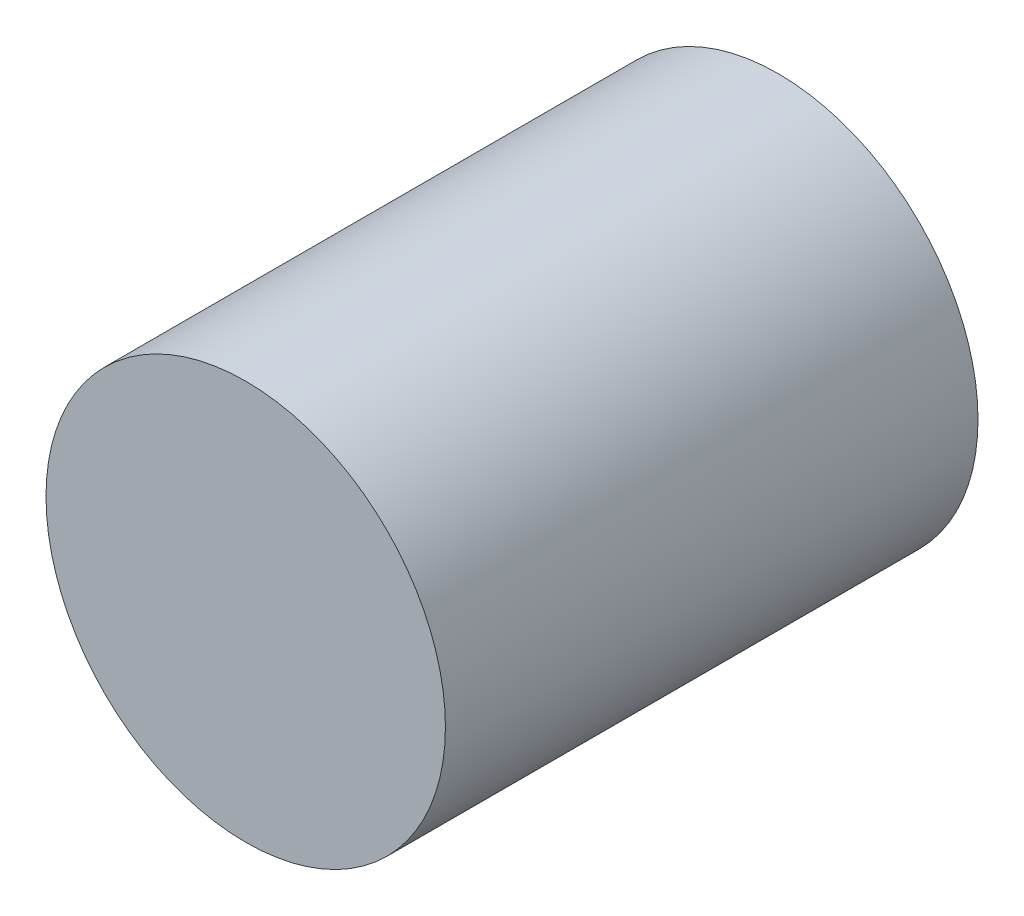
ISO-10303-21;
HEADER;
FILE_DESCRIPTION(('STEP AP214'),'2;1');
FILE_NAME('part.step','',(''),(''),'','','');
FILE_SCHEMA(('AUTOMOTIVE_DESIGN { 1 0 10303 214 1 1 1 1 }'));
ENDSEC;
DATA;
#1=APPLICATION_CONTEXT('core data for automotive mechanical design processes');
#2=APPLICATION_PROTOCOL_DEFINITION('international standard','automotive_design',2000,#1);
#3=PRODUCT_CONTEXT('',#1,'mechanical');
#4=PRODUCT('Part','Part','',(#3));
#5=PRODUCT_RELATED_PRODUCT_CATEGORY('part','',(#4));
#6=PRODUCT_DEFINITION_FORMATION('','',#4);
#7=PRODUCT_DEFINITION_CONTEXT('part definition',#1,'design');
#8=PRODUCT_DEFINITION('design','',#6,#7);
#9=PRODUCT_DEFINITION_SHAPE('','',#8);
#10=(LENGTH_UNIT() NAMED_UNIT(*) SI_UNIT(.MILLI.,.METRE.));
#11=(NAMED_UNIT(*) PLANE_ANGLE_UNIT() SI_UNIT($,.RADIAN.));
#12=(NAMED_UNIT(*) SI_UNIT($,.STERADIAN.) SOLID_ANGLE_UNIT());
#13=UNCERTAINTY_MEASURE_WITH_UNIT(LENGTH_MEASURE(1.E-05),#10,'distance_accuracy_value','');
#14=(GEOMETRIC_REPRESENTATION_CONTEXT(3) GLOBAL_UNCERTAINTY_ASSIGNED_CONTEXT((#13)) GLOBAL_UNIT_ASSIGNED_CONTEXT((#10,
#11,#12)) REPRESENTATION_CONTEXT('',''));
#15=CARTESIAN_POINT('',(0.,0.,0.));
#16=DIRECTION('',(0.,0.,1.));
#17=DIRECTION('',(1.,0.,0.));
#18=AXIS2_PLACEMENT_3D('',#15,#16,#17);
#19=CARTESIAN_POINT('',(0.,0.,16.));
#20=DIRECTION('',(0.,0.,-1.));
#21=DIRECTION('',(-1.,0.,0.));
#22=AXIS2_PLACEMENT_3D('',#19,#20,#21);
#23=CYLINDRICAL_SURFACE('',#22,6.);
#24=CARTESIAN_POINT('',(0.,0.,16.));
#25=DIRECTION('',(0.,0.,1.));
#26=DIRECTION('',(1.,0.,0.));
#27=AXIS2_PLACEMENT_3D('',#24,#25,#26);
#28=CIRCLE('',#27,6.);
#29=CARTESIAN_POINT('',(6.,0.,16.));
#30=VERTEX_POINT('',#29);
#31=EDGE_CURVE('E11',#30,#30,#28,.T.);
#32=ORIENTED_EDGE('',*,*,#31,.F.);
#33=EDGE_LOOP('',(#32));
#34=FACE_BOUND('',#33,.T.);
#35=CARTESIAN_POINT('',(0.,0.,0.));
#36=DIRECTION('',(0.,0.,1.));
#37=DIRECTION('',(1.,0.,0.));
#38=AXIS2_PLACEMENT_3D('',#35,#36,#37);
#39=CIRCLE('',#38,6.);
#40=CARTESIAN_POINT('',(6.,0.,0.));
#41=VERTEX_POINT('',#40);
#42=EDGE_CURVE('E36',#41,#41,#39,.T.);
#43=ORIENTED_EDGE('',*,*,#42,.T.);
#44=EDGE_LOOP('',(#43));
#45=FACE_BOUND('',#44,.T.);
#46=ADVANCED_FACE('F33',(#34,#45),#23,.T.);
#47=CARTESIAN_POINT('',(0.,0.,16.));
#48=DIRECTION('',(0.,0.,1.));
#49=DIRECTION('',(1.,0.,0.));
#50=AXIS2_PLACEMENT_3D('',#47,#48,#49);
#51=PLANE('',#50);
#52=ORIENTED_EDGE('',*,*,#31,.T.);
#53=EDGE_LOOP('',(#52));
#54=FACE_BOUND('',#53,.T.);
#55=ADVANCED_FACE('F58',(#54),#51,.T.);
#56=CARTESIAN_POINT('',(0.,0.,0.));
#57=DIRECTION('',(0.,0.,1.));
#58=DIRECTION('',(1.,0.,0.));
#59=AXIS2_PLACEMENT_3D('',#56,#57,#58);
#60=PLANE('',#59);
#61=CARTESIAN_POINT('',(0.,0.,0.));
#62=DIRECTION('',(0.,0.,-1.));
#63=DIRECTION('',(-1.,0.,0.));
#64=AXIS2_PLACEMENT_3D('',#61,#62,#63);
#65=CIRCLE('',#64,3.);
#66=CARTESIAN_POINT('',(-3.,0.,0.));
#67=VERTEX_POINT('',#66);
#68=EDGE_CURVE('E47',#67,#67,#65,.T.);
#69=ORIENTED_EDGE('',*,*,#68,.F.);
#70=EDGE_LOOP('',(#69));
#71=FACE_BOUND('',#70,.T.);
#72=ORIENTED_EDGE('',*,*,#42,.F.);
#73=EDGE_LOOP('',(#72));
#74=FACE_BOUND('',#73,.T.);
#75=ADVANCED_FACE('F54',(#71,#74),#60,.F.);
#76=CARTESIAN_POINT('',(0.,0.,15.8));
#77=DIRECTION('',(0.,0.,1.));
#78=DIRECTION('',(1.,0.,0.));
#79=AXIS2_PLACEMENT_3D('',#76,#77,#78);
#80=PLANE('',#79);
#81=CARTESIAN_POINT('',(0.,0.,15.8));
#82=DIRECTION('',(0.,0.,1.));
#83=DIRECTION('',(1.,0.,0.));
#84=AXIS2_PLACEMENT_3D('',#81,#82,#83);
#85=CIRCLE('',#84,3.);
#86=CARTESIAN_POINT('',(3.,0.,15.8));
#87=VERTEX_POINT('',#86);
#88=EDGE_CURVE('E43',#87,#87,#85,.F.);
#89=ORIENTED_EDGE('',*,*,#88,.T.);
#90=EDGE_LOOP('',(#89));
#91=FACE_BOUND('',#90,.T.);
#92=ADVANCED_FACE('F57',(#91),#80,.F.);
#93=CARTESIAN_POINT('',(0.,0.,24.4852813742386));
#94=DIRECTION('',(0.,0.,-1.));
#95=DIRECTION('',(-1.,0.,0.));
#96=AXIS2_PLACEMENT_3D('',#93,#94,#95);
#97=CYLINDRICAL_SURFACE('',#96,3.);
#98=ORIENTED_EDGE('',*,*,#68,.T.);
#99=EDGE_LOOP('',(#98));
#100=FACE_BOUND('',#99,.T.);
#101=ORIENTED_EDGE('',*,*,#88,.F.);
#102=EDGE_LOOP('',(#101));
#103=FACE_BOUND('',#102,.T.);
#104=ADVANCED_FACE('F51',(#100,#103),#97,.F.);
#105=CLOSED_SHELL('',(#46,#55,#75,#92,#104));
#106=MANIFOLD_SOLID_BREP('B2',#105);
#107=ADVANCED_BREP_SHAPE_REPRESENTATION('',(#18,#106),#14);
#108=SHAPE_DEFINITION_REPRESENTATION(#9,#107);
ENDSEC;
END-ISO-10303-21;
